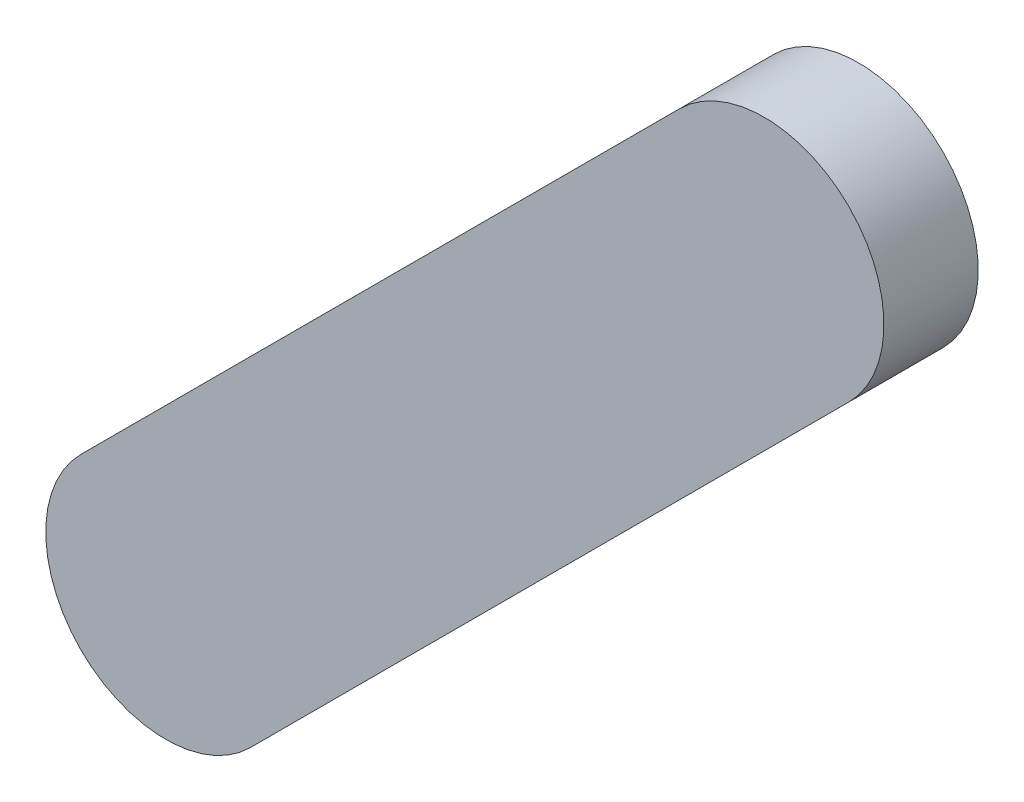
ISO-10303-21;
HEADER;
FILE_DESCRIPTION(('STEP AP214'),'2;1');
FILE_NAME('part.step','',(''),(''),'','','');
FILE_SCHEMA(('AUTOMOTIVE_DESIGN { 1 0 10303 214 1 1 1 1 }'));
ENDSEC;
DATA;
#1=APPLICATION_CONTEXT('core data for automotive mechanical design processes');
#2=APPLICATION_PROTOCOL_DEFINITION('international standard','automotive_design',2000,#1);
#3=PRODUCT_CONTEXT('',#1,'mechanical');
#4=PRODUCT('Part','Part','',(#3));
#5=PRODUCT_RELATED_PRODUCT_CATEGORY('part','',(#4));
#6=PRODUCT_DEFINITION_FORMATION('','',#4);
#7=PRODUCT_DEFINITION_CONTEXT('part definition',#1,'design');
#8=PRODUCT_DEFINITION('design','',#6,#7);
#9=PRODUCT_DEFINITION_SHAPE('','',#8);
#10=(LENGTH_UNIT() NAMED_UNIT(*) SI_UNIT(.MILLI.,.METRE.));
#11=(NAMED_UNIT(*) PLANE_ANGLE_UNIT() SI_UNIT($,.RADIAN.));
#12=(NAMED_UNIT(*) SI_UNIT($,.STERADIAN.) SOLID_ANGLE_UNIT());
#13=UNCERTAINTY_MEASURE_WITH_UNIT(LENGTH_MEASURE(1.E-05),#10,'distance_accuracy_value','');
#14=(GEOMETRIC_REPRESENTATION_CONTEXT(3) GLOBAL_UNCERTAINTY_ASSIGNED_CONTEXT((#13)) GLOBAL_UNIT_ASSIGNED_CONTEXT((#10,
#11,#12)) REPRESENTATION_CONTEXT('',''));
#15=CARTESIAN_POINT('',(0.,0.,0.));
#16=DIRECTION('',(0.,0.,1.));
#17=DIRECTION('',(1.,0.,0.));
#18=AXIS2_PLACEMENT_3D('',#15,#16,#17);
#19=CARTESIAN_POINT('',(91.87360594,64.0823966,0.));
#20=DIRECTION('',(-0.707106781186544,0.707106781186552,0.));
#21=DIRECTION('',(0.707106781186552,0.707106781186544,0.));
#22=AXIS2_PLACEMENT_3D('',#19,#20,#21);
#23=PLANE('',#22);
#24=DIRECTION('',(0.707106781186552,0.707106781186544,0.));
#25=VECTOR('',#24,1.);
#26=CARTESIAN_POINT('',(91.87360594,64.0823966,0.1999996));
#27=LINE('',#26,#25);
#28=CARTESIAN_POINT('',(91.87360594,64.0823966,0.1999996));
#29=VERTEX_POINT('',#28);
#30=CARTESIAN_POINT('',(93.1436034,65.35239406,0.1999996));
#31=VERTEX_POINT('',#30);
#32=EDGE_CURVE('E11',#29,#31,#27,.T.);
#33=ORIENTED_EDGE('',*,*,#32,.F.);
#34=DIRECTION('',(0.,0.,1.));
#35=VECTOR('',#34,1.);
#36=CARTESIAN_POINT('',(91.87360594,64.0823966,0.));
#37=LINE('',#36,#35);
#38=CARTESIAN_POINT('',(91.87360594,64.0823966,0.));
#39=VERTEX_POINT('',#38);
#40=EDGE_CURVE('E24',#39,#29,#37,.T.);
#41=ORIENTED_EDGE('',*,*,#40,.F.);
#42=DIRECTION('',(0.707106781186552,0.707106781186544,0.));
#43=VECTOR('',#42,1.);
#44=CARTESIAN_POINT('',(91.87360594,64.0823966,0.));
#45=LINE('',#44,#43);
#46=CARTESIAN_POINT('',(93.1436034,65.35239406,0.));
#47=VERTEX_POINT('',#46);
#48=EDGE_CURVE('E75',#39,#47,#45,.T.);
#49=ORIENTED_EDGE('',*,*,#48,.T.);
#50=DIRECTION('',(0.,0.,1.));
#51=VECTOR('',#50,1.);
#52=CARTESIAN_POINT('',(93.1436034,65.35239406,0.));
#53=LINE('',#52,#51);
#54=EDGE_CURVE('E37',#47,#31,#53,.T.);
#55=ORIENTED_EDGE('',*,*,#54,.T.);
#56=EDGE_LOOP('',(#33,#41,#49,#55));
#57=FACE_BOUND('',#56,.T.);
#58=ADVANCED_FACE('F17',(#57),#23,.F.);
#59=CARTESIAN_POINT('',(92.96399873,65.53199873,0.));
#60=DIRECTION('',(0.,0.,-1.));
#61=DIRECTION('',(0.707106781186548,-0.707106781186548,0.));
#62=AXIS2_PLACEMENT_3D('',#59,#60,#61);
#63=CYLINDRICAL_SURFACE('',#62,0.253999360179549);
#64=CARTESIAN_POINT('',(92.96399873,65.53199873,0.1999996));
#65=DIRECTION('',(0.,0.,1.));
#66=DIRECTION('',(0.707106781186548,-0.707106781186548,0.));
#67=AXIS2_PLACEMENT_3D('',#64,#65,#66);
#68=CIRCLE('',#67,0.253999360179549);
#69=CARTESIAN_POINT('',(92.78439406,65.7116034,0.1999996));
#70=VERTEX_POINT('',#69);
#71=EDGE_CURVE('E83',#31,#70,#68,.T.);
#72=ORIENTED_EDGE('',*,*,#71,.F.);
#73=ORIENTED_EDGE('',*,*,#54,.F.);
#74=CARTESIAN_POINT('',(92.96399873,65.53199873,0.));
#75=DIRECTION('',(0.,0.,1.));
#76=DIRECTION('',(0.707106781186548,-0.707106781186548,0.));
#77=AXIS2_PLACEMENT_3D('',#74,#75,#76);
#78=CIRCLE('',#77,0.253999360179549);
#79=CARTESIAN_POINT('',(92.78439406,65.7116034,0.));
#80=VERTEX_POINT('',#79);
#81=EDGE_CURVE('E81',#47,#80,#78,.T.);
#82=ORIENTED_EDGE('',*,*,#81,.T.);
#83=DIRECTION('',(0.,0.,1.));
#84=VECTOR('',#83,1.);
#85=CARTESIAN_POINT('',(92.78439406,65.7116034,0.));
#86=LINE('',#85,#84);
#87=EDGE_CURVE('E67',#80,#70,#86,.T.);
#88=ORIENTED_EDGE('',*,*,#87,.T.);
#89=EDGE_LOOP('',(#72,#73,#82,#88));
#90=FACE_BOUND('',#89,.T.);
#91=ADVANCED_FACE('F89',(#90),#63,.T.);
#92=CARTESIAN_POINT('',(92.78439406,65.7116034,0.));
#93=DIRECTION('',(0.707106781186548,-0.707106781186548,0.));
#94=DIRECTION('',(-0.707106781186548,-0.707106781186548,0.));
#95=AXIS2_PLACEMENT_3D('',#92,#93,#94);
#96=PLANE('',#95);
#97=DIRECTION('',(-0.707106781186548,-0.707106781186548,0.));
#98=VECTOR('',#97,1.);
#99=CARTESIAN_POINT('',(92.78439406,65.7116034,0.1999996));
#100=LINE('',#99,#98);
#101=CARTESIAN_POINT('',(91.5143966,64.44160594,0.1999996));
#102=VERTEX_POINT('',#101);
#103=EDGE_CURVE('E71',#70,#102,#100,.T.);
#104=ORIENTED_EDGE('',*,*,#103,.F.);
#105=ORIENTED_EDGE('',*,*,#87,.F.);
#106=DIRECTION('',(-0.707106781186548,-0.707106781186548,0.));
#107=VECTOR('',#106,1.);
#108=CARTESIAN_POINT('',(92.78439406,65.7116034,0.));
#109=LINE('',#108,#107);
#110=CARTESIAN_POINT('',(91.5143966,64.44160594,0.));
#111=VERTEX_POINT('',#110);
#112=EDGE_CURVE('E63',#80,#111,#109,.T.);
#113=ORIENTED_EDGE('',*,*,#112,.T.);
#114=DIRECTION('',(0.,0.,1.));
#115=VECTOR('',#114,1.);
#116=CARTESIAN_POINT('',(91.5143966,64.44160594,0.));
#117=LINE('',#116,#115);
#118=EDGE_CURVE('E53',#111,#102,#117,.T.);
#119=ORIENTED_EDGE('',*,*,#118,.T.);
#120=EDGE_LOOP('',(#104,#105,#113,#119));
#121=FACE_BOUND('',#120,.T.);
#122=ADVANCED_FACE('F66',(#121),#96,.F.);
#123=CARTESIAN_POINT('',(91.69400127,64.26200127,0.));
#124=DIRECTION('',(0.,0.,-1.));
#125=DIRECTION('',(-0.707106781186548,0.707106781186548,0.));
#126=AXIS2_PLACEMENT_3D('',#123,#124,#125);
#127=CYLINDRICAL_SURFACE('',#126,0.253999360179546);
#128=CARTESIAN_POINT('',(91.69400127,64.26200127,0.1999996));
#129=DIRECTION('',(0.,0.,1.));
#130=DIRECTION('',(-0.707106781186548,0.707106781186548,0.));
#131=AXIS2_PLACEMENT_3D('',#128,#129,#130);
#132=CIRCLE('',#131,0.253999360179546);
#133=EDGE_CURVE('E59',#102,#29,#132,.T.);
#134=ORIENTED_EDGE('',*,*,#133,.F.);
#135=ORIENTED_EDGE('',*,*,#118,.F.);
#136=CARTESIAN_POINT('',(91.69400127,64.26200127,0.));
#137=DIRECTION('',(0.,0.,1.));
#138=DIRECTION('',(-0.707106781186548,0.707106781186548,0.));
#139=AXIS2_PLACEMENT_3D('',#136,#137,#138);
#140=CIRCLE('',#139,0.253999360179546);
#141=EDGE_CURVE('E57',#111,#39,#140,.T.);
#142=ORIENTED_EDGE('',*,*,#141,.T.);
#143=ORIENTED_EDGE('',*,*,#40,.T.);
#144=EDGE_LOOP('',(#134,#135,#142,#143));
#145=FACE_BOUND('',#144,.T.);
#146=ADVANCED_FACE('F55',(#145),#127,.T.);
#147=CARTESIAN_POINT('',(91.87360594,64.0823966,0.));
#148=DIRECTION('',(0.,0.,-1.));
#149=DIRECTION('',(-1.,0.,0.));
#150=AXIS2_PLACEMENT_3D('',#147,#148,#149);
#151=PLANE('',#150);
#152=ORIENTED_EDGE('',*,*,#141,.F.);
#153=ORIENTED_EDGE('',*,*,#112,.F.);
#154=ORIENTED_EDGE('',*,*,#81,.F.);
#155=ORIENTED_EDGE('',*,*,#48,.F.);
#156=EDGE_LOOP('',(#152,#153,#154,#155));
#157=FACE_BOUND('',#156,.T.);
#158=ADVANCED_FACE('F74',(#157),#151,.T.);
#159=CARTESIAN_POINT('',(91.87360594,64.0823966,0.1999996));
#160=DIRECTION('',(0.,0.,-1.));
#161=DIRECTION('',(-1.,0.,0.));
#162=AXIS2_PLACEMENT_3D('',#159,#160,#161);
#163=PLANE('',#162);
#164=ORIENTED_EDGE('',*,*,#32,.T.);
#165=ORIENTED_EDGE('',*,*,#71,.T.);
#166=ORIENTED_EDGE('',*,*,#103,.T.);
#167=ORIENTED_EDGE('',*,*,#133,.T.);
#168=EDGE_LOOP('',(#164,#165,#166,#167));
#169=FACE_BOUND('',#168,.T.);
#170=ADVANCED_FACE('F91',(#169),#163,.F.);
#171=CLOSED_SHELL('',(#58,#91,#122,#146,#158,#170));
#172=MANIFOLD_SOLID_BREP('B1',#171);
#173=ADVANCED_BREP_SHAPE_REPRESENTATION('',(#18,#172),#14);
#174=SHAPE_DEFINITION_REPRESENTATION(#9,#173);
ENDSEC;
END-ISO-10303-21;
